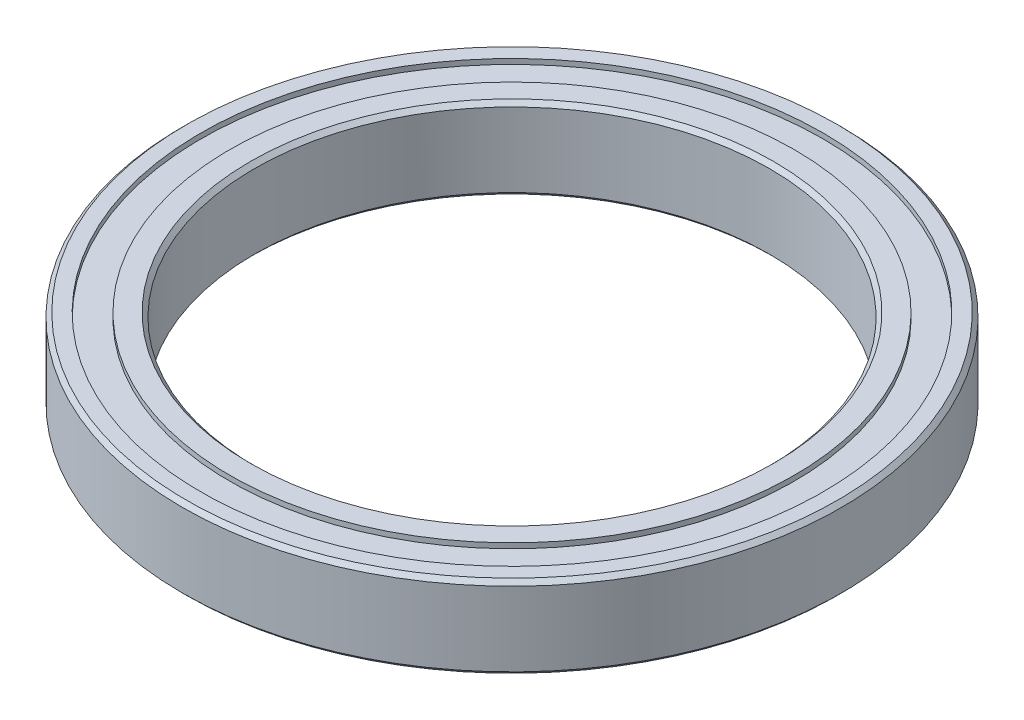
ISO-10303-21;
HEADER;
FILE_DESCRIPTION(('STEP AP214'),'2;1');
FILE_NAME('part.step','',(''),(''),'','','');
FILE_SCHEMA(('AUTOMOTIVE_DESIGN { 1 0 10303 214 1 1 1 1 }'));
ENDSEC;
DATA;
#1=APPLICATION_CONTEXT('core data for automotive mechanical design processes');
#2=APPLICATION_PROTOCOL_DEFINITION('international standard','automotive_design',2000,#1);
#3=PRODUCT_CONTEXT('',#1,'mechanical');
#4=PRODUCT('Part','Part','',(#3));
#5=PRODUCT_RELATED_PRODUCT_CATEGORY('part','',(#4));
#6=PRODUCT_DEFINITION_FORMATION('','',#4);
#7=PRODUCT_DEFINITION_CONTEXT('part definition',#1,'design');
#8=PRODUCT_DEFINITION('design','',#6,#7);
#9=PRODUCT_DEFINITION_SHAPE('','',#8);
#10=(LENGTH_UNIT() NAMED_UNIT(*) SI_UNIT(.MILLI.,.METRE.));
#11=(NAMED_UNIT(*) PLANE_ANGLE_UNIT() SI_UNIT($,.RADIAN.));
#12=(NAMED_UNIT(*) SI_UNIT($,.STERADIAN.) SOLID_ANGLE_UNIT());
#13=UNCERTAINTY_MEASURE_WITH_UNIT(LENGTH_MEASURE(1.E-05),#10,'distance_accuracy_value','');
#14=(GEOMETRIC_REPRESENTATION_CONTEXT(3) GLOBAL_UNCERTAINTY_ASSIGNED_CONTEXT((#13)) GLOBAL_UNIT_ASSIGNED_CONTEXT((#10,
#11,#12)) REPRESENTATION_CONTEXT('',''));
#15=CARTESIAN_POINT('',(0.,0.,0.));
#16=DIRECTION('',(0.,0.,1.));
#17=DIRECTION('',(1.,0.,0.));
#18=AXIS2_PLACEMENT_3D('',#15,#16,#17);
#19=CARTESIAN_POINT('',(0.,-2.,16.));
#20=DIRECTION('',(0.,1.,0.));
#21=DIRECTION('',(0.,0.,1.));
#22=AXIS2_PLACEMENT_3D('',#19,#20,#21);
#23=PLANE('',#22);
#24=CARTESIAN_POINT('',(0.,-2.,0.));
#25=DIRECTION('',(0.,1.,0.));
#26=DIRECTION('',(0.,0.,1.));
#27=AXIS2_PLACEMENT_3D('',#24,#25,#26);
#28=CIRCLE('',#27,15.8);
#29=CARTESIAN_POINT('',(0.,-2.,15.8));
#30=VERTEX_POINT('',#29);
#31=EDGE_CURVE('E10',#30,#30,#28,.F.);
#32=ORIENTED_EDGE('',*,*,#31,.T.);
#33=EDGE_LOOP('',(#32));
#34=FACE_BOUND('',#33,.T.);
#35=CARTESIAN_POINT('',(0.,-2.,0.));
#36=DIRECTION('',(0.,-1.,0.));
#37=DIRECTION('',(0.,0.,-1.));
#38=AXIS2_PLACEMENT_3D('',#35,#36,#37);
#39=CIRCLE('',#38,15.1);
#40=CARTESIAN_POINT('',(0.,-2.,-15.1));
#41=VERTEX_POINT('',#40);
#42=EDGE_CURVE('E66',#41,#41,#39,.T.);
#43=ORIENTED_EDGE('',*,*,#42,.F.);
#44=EDGE_LOOP('',(#43));
#45=FACE_BOUND('',#44,.T.);
#46=ADVANCED_FACE('F34',(#34,#45),#23,.F.);
#47=CARTESIAN_POINT('',(0.,-18.1229138650565,0.));
#48=DIRECTION('',(0.,-1.,0.));
#49=DIRECTION('',(0.,0.,-1.));
#50=AXIS2_PLACEMENT_3D('',#47,#48,#49);
#51=CYLINDRICAL_SURFACE('',#50,15.1);
#52=CARTESIAN_POINT('',(0.,-1.75,0.));
#53=DIRECTION('',(0.,-1.,0.));
#54=DIRECTION('',(0.,0.,-1.));
#55=AXIS2_PLACEMENT_3D('',#52,#53,#54);
#56=CIRCLE('',#55,15.1);
#57=CARTESIAN_POINT('',(0.,-1.75,-15.1));
#58=VERTEX_POINT('',#57);
#59=EDGE_CURVE('E69',#58,#58,#56,.T.);
#60=ORIENTED_EDGE('',*,*,#59,.F.);
#61=EDGE_LOOP('',(#60));
#62=FACE_BOUND('',#61,.T.);
#63=ORIENTED_EDGE('',*,*,#42,.T.);
#64=EDGE_LOOP('',(#63));
#65=FACE_BOUND('',#64,.T.);
#66=ADVANCED_FACE('F123',(#62,#65),#51,.F.);
#67=CARTESIAN_POINT('',(0.,-1.75,15.1));
#68=DIRECTION('',(0.,1.,0.));
#69=DIRECTION('',(0.,0.,1.));
#70=AXIS2_PLACEMENT_3D('',#67,#68,#69);
#71=PLANE('',#70);
#72=CARTESIAN_POINT('',(0.,-1.75,0.));
#73=DIRECTION('',(0.,-1.,0.));
#74=DIRECTION('',(0.,0.,-1.));
#75=AXIS2_PLACEMENT_3D('',#72,#73,#74);
#76=CIRCLE('',#75,13.7);
#77=CARTESIAN_POINT('',(0.,-1.75,-13.7));
#78=VERTEX_POINT('',#77);
#79=EDGE_CURVE('E72',#78,#78,#76,.T.);
#80=ORIENTED_EDGE('',*,*,#79,.F.);
#81=EDGE_LOOP('',(#80));
#82=FACE_BOUND('',#81,.T.);
#83=ORIENTED_EDGE('',*,*,#59,.T.);
#84=EDGE_LOOP('',(#83));
#85=FACE_BOUND('',#84,.T.);
#86=ADVANCED_FACE('F128',(#82,#85),#71,.F.);
#87=CARTESIAN_POINT('',(0.,-18.1229138650565,0.));
#88=DIRECTION('',(0.,-1.,0.));
#89=DIRECTION('',(0.,0.,-1.));
#90=AXIS2_PLACEMENT_3D('',#87,#88,#89);
#91=CYLINDRICAL_SURFACE('',#90,13.7);
#92=CARTESIAN_POINT('',(0.,-2.,0.));
#93=DIRECTION('',(0.,-1.,0.));
#94=DIRECTION('',(0.,0.,-1.));
#95=AXIS2_PLACEMENT_3D('',#92,#93,#94);
#96=CIRCLE('',#95,13.7);
#97=CARTESIAN_POINT('',(0.,-2.,-13.7));
#98=VERTEX_POINT('',#97);
#99=EDGE_CURVE('E75',#98,#98,#96,.T.);
#100=ORIENTED_EDGE('',*,*,#99,.F.);
#101=EDGE_LOOP('',(#100));
#102=FACE_BOUND('',#101,.T.);
#103=ORIENTED_EDGE('',*,*,#79,.T.);
#104=EDGE_LOOP('',(#103));
#105=FACE_BOUND('',#104,.T.);
#106=ADVANCED_FACE('F181',(#102,#105),#91,.T.);
#107=CARTESIAN_POINT('',(0.,-2.,13.7));
#108=DIRECTION('',(0.,1.,0.));
#109=DIRECTION('',(0.,0.,1.));
#110=AXIS2_PLACEMENT_3D('',#107,#108,#109);
#111=PLANE('',#110);
#112=CARTESIAN_POINT('',(0.,-2.,0.));
#113=DIRECTION('',(0.,1.,0.));
#114=DIRECTION('',(0.,0.,1.));
#115=AXIS2_PLACEMENT_3D('',#112,#113,#114);
#116=CIRCLE('',#115,12.7);
#117=CARTESIAN_POINT('',(0.,-2.,12.7));
#118=VERTEX_POINT('',#117);
#119=EDGE_CURVE('E54',#118,#118,#116,.T.);
#120=ORIENTED_EDGE('',*,*,#119,.T.);
#121=EDGE_LOOP('',(#120));
#122=FACE_BOUND('',#121,.T.);
#123=ORIENTED_EDGE('',*,*,#99,.T.);
#124=EDGE_LOOP('',(#123));
#125=FACE_BOUND('',#124,.T.);
#126=ADVANCED_FACE('F119',(#122,#125),#111,.F.);
#127=CARTESIAN_POINT('',(0.,-18.1229138650565,0.));
#128=DIRECTION('',(0.,-1.,0.));
#129=DIRECTION('',(0.,0.,-1.));
#130=AXIS2_PLACEMENT_3D('',#127,#128,#129);
#131=CYLINDRICAL_SURFACE('',#130,12.5);
#132=CARTESIAN_POINT('',(0.,1.8,0.));
#133=DIRECTION('',(0.,-1.,0.));
#134=DIRECTION('',(0.,0.,-1.));
#135=AXIS2_PLACEMENT_3D('',#132,#133,#134);
#136=CIRCLE('',#135,12.5);
#137=CARTESIAN_POINT('',(0.,1.8,-12.5));
#138=VERTEX_POINT('',#137);
#139=EDGE_CURVE('E57',#138,#138,#136,.F.);
#140=ORIENTED_EDGE('',*,*,#139,.T.);
#141=EDGE_LOOP('',(#140));
#142=FACE_BOUND('',#141,.T.);
#143=CARTESIAN_POINT('',(0.,-1.79999999999999,0.));
#144=DIRECTION('',(0.,1.,0.));
#145=DIRECTION('',(0.,0.,1.));
#146=AXIS2_PLACEMENT_3D('',#143,#144,#145);
#147=CIRCLE('',#146,12.5);
#148=CARTESIAN_POINT('',(0.,-1.79999999999999,12.5));
#149=VERTEX_POINT('',#148);
#150=EDGE_CURVE('E60',#149,#149,#147,.F.);
#151=ORIENTED_EDGE('',*,*,#150,.T.);
#152=EDGE_LOOP('',(#151));
#153=FACE_BOUND('',#152,.T.);
#154=ADVANCED_FACE('F113',(#142,#153),#131,.F.);
#155=CARTESIAN_POINT('',(0.,2.,13.7));
#156=DIRECTION('',(0.,-1.,0.));
#157=DIRECTION('',(0.,0.,-1.));
#158=AXIS2_PLACEMENT_3D('',#155,#156,#157);
#159=PLANE('',#158);
#160=CARTESIAN_POINT('',(0.,2.,0.));
#161=DIRECTION('',(0.,-1.,0.));
#162=DIRECTION('',(0.,0.,-1.));
#163=AXIS2_PLACEMENT_3D('',#160,#161,#162);
#164=CIRCLE('',#163,12.7);
#165=CARTESIAN_POINT('',(0.,2.,-12.7));
#166=VERTEX_POINT('',#165);
#167=EDGE_CURVE('E63',#166,#166,#164,.T.);
#168=ORIENTED_EDGE('',*,*,#167,.T.);
#169=EDGE_LOOP('',(#168));
#170=FACE_BOUND('',#169,.T.);
#171=CARTESIAN_POINT('',(0.,2.,0.));
#172=DIRECTION('',(0.,-1.,0.));
#173=DIRECTION('',(0.,0.,-1.));
#174=AXIS2_PLACEMENT_3D('',#171,#172,#173);
#175=CIRCLE('',#174,13.7);
#176=CARTESIAN_POINT('',(0.,2.,-13.7));
#177=VERTEX_POINT('',#176);
#178=EDGE_CURVE('E78',#177,#177,#175,.T.);
#179=ORIENTED_EDGE('',*,*,#178,.F.);
#180=EDGE_LOOP('',(#179));
#181=FACE_BOUND('',#180,.T.);
#182=ADVANCED_FACE('F108',(#170,#181),#159,.F.);
#183=CARTESIAN_POINT('',(0.,-18.1229138650565,0.));
#184=DIRECTION('',(0.,-1.,0.));
#185=DIRECTION('',(0.,0.,-1.));
#186=AXIS2_PLACEMENT_3D('',#183,#184,#185);
#187=CYLINDRICAL_SURFACE('',#186,13.7);
#188=CARTESIAN_POINT('',(0.,1.75,0.));
#189=DIRECTION('',(0.,-1.,0.));
#190=DIRECTION('',(0.,0.,-1.));
#191=AXIS2_PLACEMENT_3D('',#188,#189,#190);
#192=CIRCLE('',#191,13.7);
#193=CARTESIAN_POINT('',(0.,1.75,-13.7));
#194=VERTEX_POINT('',#193);
#195=EDGE_CURVE('E81',#194,#194,#192,.T.);
#196=ORIENTED_EDGE('',*,*,#195,.F.);
#197=EDGE_LOOP('',(#196));
#198=FACE_BOUND('',#197,.T.);
#199=ORIENTED_EDGE('',*,*,#178,.T.);
#200=EDGE_LOOP('',(#199));
#201=FACE_BOUND('',#200,.T.);
#202=ADVANCED_FACE('F102',(#198,#201),#187,.T.);
#203=CARTESIAN_POINT('',(0.,1.75,15.1));
#204=DIRECTION('',(0.,-1.,0.));
#205=DIRECTION('',(0.,0.,-1.));
#206=AXIS2_PLACEMENT_3D('',#203,#204,#205);
#207=PLANE('',#206);
#208=CARTESIAN_POINT('',(0.,1.75,0.));
#209=DIRECTION('',(0.,-1.,0.));
#210=DIRECTION('',(0.,0.,-1.));
#211=AXIS2_PLACEMENT_3D('',#208,#209,#210);
#212=CIRCLE('',#211,15.1);
#213=CARTESIAN_POINT('',(0.,1.75,-15.1));
#214=VERTEX_POINT('',#213);
#215=EDGE_CURVE('E84',#214,#214,#212,.T.);
#216=ORIENTED_EDGE('',*,*,#215,.F.);
#217=EDGE_LOOP('',(#216));
#218=FACE_BOUND('',#217,.T.);
#219=ORIENTED_EDGE('',*,*,#195,.T.);
#220=EDGE_LOOP('',(#219));
#221=FACE_BOUND('',#220,.T.);
#222=ADVANCED_FACE('F96',(#218,#221),#207,.F.);
#223=CARTESIAN_POINT('',(0.,-18.1229138650565,0.));
#224=DIRECTION('',(0.,-1.,0.));
#225=DIRECTION('',(0.,0.,-1.));
#226=AXIS2_PLACEMENT_3D('',#223,#224,#225);
#227=CYLINDRICAL_SURFACE('',#226,15.1);
#228=CARTESIAN_POINT('',(0.,2.,0.));
#229=DIRECTION('',(0.,-1.,0.));
#230=DIRECTION('',(0.,0.,-1.));
#231=AXIS2_PLACEMENT_3D('',#228,#229,#230);
#232=CIRCLE('',#231,15.1);
#233=CARTESIAN_POINT('',(0.,2.,-15.1));
#234=VERTEX_POINT('',#233);
#235=EDGE_CURVE('E87',#234,#234,#232,.T.);
#236=ORIENTED_EDGE('',*,*,#235,.F.);
#237=EDGE_LOOP('',(#236));
#238=FACE_BOUND('',#237,.T.);
#239=ORIENTED_EDGE('',*,*,#215,.T.);
#240=EDGE_LOOP('',(#239));
#241=FACE_BOUND('',#240,.T.);
#242=ADVANCED_FACE('F93',(#238,#241),#227,.F.);
#243=CARTESIAN_POINT('',(0.,2.,16.));
#244=DIRECTION('',(0.,-1.,0.));
#245=DIRECTION('',(0.,0.,-1.));
#246=AXIS2_PLACEMENT_3D('',#243,#244,#245);
#247=PLANE('',#246);
#248=CARTESIAN_POINT('',(0.,2.,0.));
#249=DIRECTION('',(0.,-1.,0.));
#250=DIRECTION('',(0.,0.,-1.));
#251=AXIS2_PLACEMENT_3D('',#248,#249,#250);
#252=CIRCLE('',#251,15.8);
#253=CARTESIAN_POINT('',(0.,2.,-15.8));
#254=VERTEX_POINT('',#253);
#255=EDGE_CURVE('E41',#254,#254,#252,.F.);
#256=ORIENTED_EDGE('',*,*,#255,.T.);
#257=EDGE_LOOP('',(#256));
#258=FACE_BOUND('',#257,.T.);
#259=ORIENTED_EDGE('',*,*,#235,.T.);
#260=EDGE_LOOP('',(#259));
#261=FACE_BOUND('',#260,.T.);
#262=ADVANCED_FACE('F91',(#258,#261),#247,.F.);
#263=CARTESIAN_POINT('',(0.,-18.1229138650565,0.));
#264=DIRECTION('',(0.,-1.,0.));
#265=DIRECTION('',(0.,0.,-1.));
#266=AXIS2_PLACEMENT_3D('',#263,#264,#265);
#267=CYLINDRICAL_SURFACE('',#266,16.);
#268=CARTESIAN_POINT('',(0.,1.80000000000001,0.));
#269=DIRECTION('',(0.,-1.,0.));
#270=DIRECTION('',(0.,0.,-1.));
#271=AXIS2_PLACEMENT_3D('',#268,#269,#270);
#272=CIRCLE('',#271,16.);
#273=CARTESIAN_POINT('',(0.,1.80000000000001,-16.));
#274=VERTEX_POINT('',#273);
#275=EDGE_CURVE('E45',#274,#274,#272,.T.);
#276=ORIENTED_EDGE('',*,*,#275,.T.);
#277=EDGE_LOOP('',(#276));
#278=FACE_BOUND('',#277,.T.);
#279=CARTESIAN_POINT('',(0.,-1.80000000000002,0.));
#280=DIRECTION('',(0.,1.,0.));
#281=DIRECTION('',(0.,0.,1.));
#282=AXIS2_PLACEMENT_3D('',#279,#280,#281);
#283=CIRCLE('',#282,16.);
#284=CARTESIAN_POINT('',(0.,-1.80000000000002,16.));
#285=VERTEX_POINT('',#284);
#286=EDGE_CURVE('E49',#285,#285,#283,.T.);
#287=ORIENTED_EDGE('',*,*,#286,.T.);
#288=EDGE_LOOP('',(#287));
#289=FACE_BOUND('',#288,.T.);
#290=ADVANCED_FACE('F138',(#278,#289),#267,.T.);
#291=CARTESIAN_POINT('',(0.,2.,0.));
#292=DIRECTION('',(0.,1.,0.));
#293=DIRECTION('',(0.,0.,1.));
#294=AXIS2_PLACEMENT_3D('',#291,#292,#293);
#295=CONICAL_SURFACE('',#294,12.7,0.785398163397448);
#296=ORIENTED_EDGE('',*,*,#139,.F.);
#297=EDGE_LOOP('',(#296));
#298=FACE_BOUND('',#297,.T.);
#299=ORIENTED_EDGE('',*,*,#167,.F.);
#300=EDGE_LOOP('',(#299));
#301=FACE_BOUND('',#300,.T.);
#302=ADVANCED_FACE('F134',(#298,#301),#295,.F.);
#303=CARTESIAN_POINT('',(0.,-1.79999999999999,0.));
#304=DIRECTION('',(0.,-1.,0.));
#305=DIRECTION('',(0.,0.,-1.));
#306=AXIS2_PLACEMENT_3D('',#303,#304,#305);
#307=CONICAL_SURFACE('',#306,12.5,0.785398163397453);
#308=ORIENTED_EDGE('',*,*,#119,.F.);
#309=EDGE_LOOP('',(#308));
#310=FACE_BOUND('',#309,.T.);
#311=ORIENTED_EDGE('',*,*,#150,.F.);
#312=EDGE_LOOP('',(#311));
#313=FACE_BOUND('',#312,.T.);
#314=ADVANCED_FACE('F137',(#310,#313),#307,.F.);
#315=CARTESIAN_POINT('',(0.,1.80000000000001,0.));
#316=DIRECTION('',(0.,-1.,0.));
#317=DIRECTION('',(0.,0.,-1.));
#318=AXIS2_PLACEMENT_3D('',#315,#316,#317);
#319=CONICAL_SURFACE('',#318,16.,0.785398163397448);
#320=ORIENTED_EDGE('',*,*,#255,.F.);
#321=EDGE_LOOP('',(#320));
#322=FACE_BOUND('',#321,.T.);
#323=ORIENTED_EDGE('',*,*,#275,.F.);
#324=EDGE_LOOP('',(#323));
#325=FACE_BOUND('',#324,.T.);
#326=ADVANCED_FACE('F141',(#322,#325),#319,.T.);
#327=CARTESIAN_POINT('',(0.,-2.,0.));
#328=DIRECTION('',(0.,1.,0.));
#329=DIRECTION('',(0.,0.,1.));
#330=AXIS2_PLACEMENT_3D('',#327,#328,#329);
#331=CONICAL_SURFACE('',#330,15.8,0.785398163397466);
#332=ORIENTED_EDGE('',*,*,#286,.F.);
#333=EDGE_LOOP('',(#332));
#334=FACE_BOUND('',#333,.T.);
#335=ORIENTED_EDGE('',*,*,#31,.F.);
#336=EDGE_LOOP('',(#335));
#337=FACE_BOUND('',#336,.T.);
#338=ADVANCED_FACE('F36',(#334,#337),#331,.T.);
#339=CLOSED_SHELL('',(#46,#66,#86,#106,#126,#154,#182,#202,#222,#242,#262,#290,#302,#314,#326,#338));
#340=MANIFOLD_SOLID_BREP('B2',#339);
#341=ADVANCED_BREP_SHAPE_REPRESENTATION('',(#18,#340),#14);
#342=SHAPE_DEFINITION_REPRESENTATION(#9,#341);
ENDSEC;
END-ISO-10303-21;
